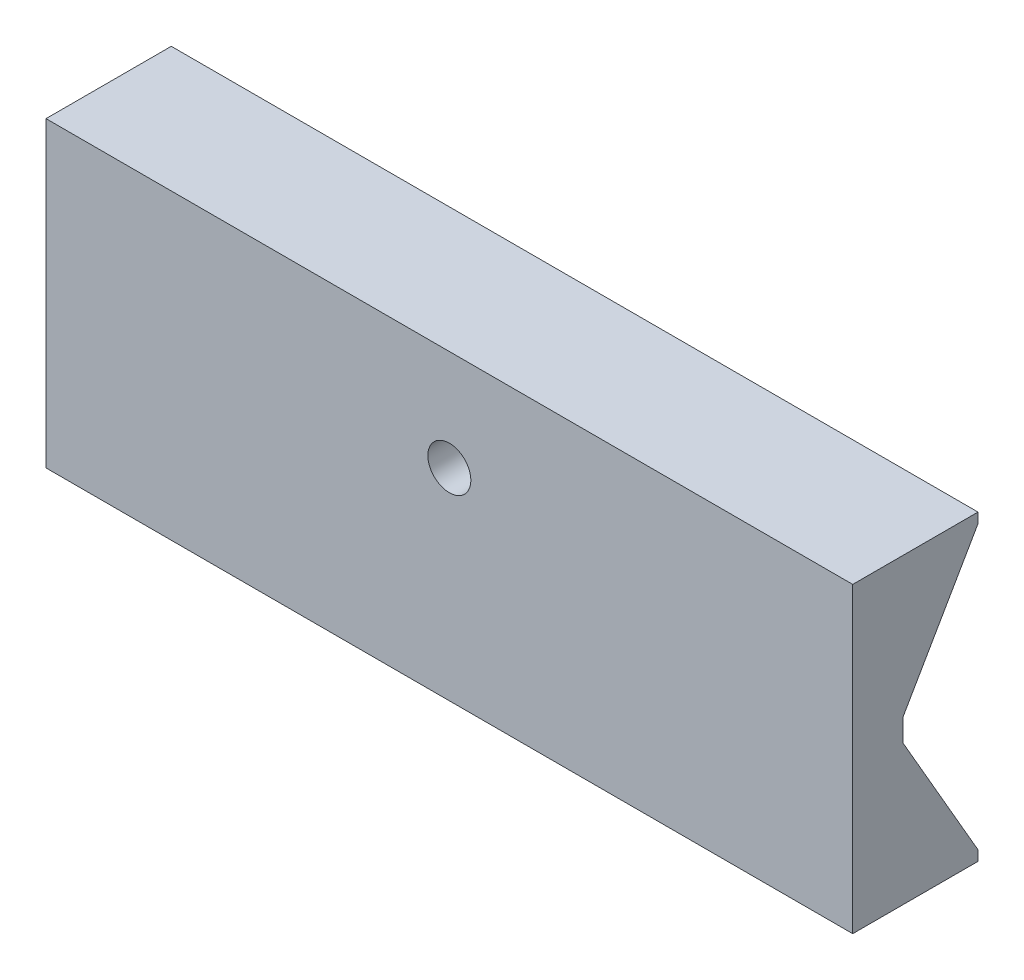
ISO-10303-21;
HEADER;
FILE_DESCRIPTION(('STEP AP214'),'2;1');
FILE_NAME('part.step','',(''),(''),'','','');
FILE_SCHEMA(('AUTOMOTIVE_DESIGN { 1 0 10303 214 1 1 1 1 }'));
ENDSEC;
DATA;
#1=APPLICATION_CONTEXT('core data for automotive mechanical design processes');
#2=APPLICATION_PROTOCOL_DEFINITION('international standard','automotive_design',2000,#1);
#3=PRODUCT_CONTEXT('',#1,'mechanical');
#4=PRODUCT('Part','Part','',(#3));
#5=PRODUCT_RELATED_PRODUCT_CATEGORY('part','',(#4));
#6=PRODUCT_DEFINITION_FORMATION('','',#4);
#7=PRODUCT_DEFINITION_CONTEXT('part definition',#1,'design');
#8=PRODUCT_DEFINITION('design','',#6,#7);
#9=PRODUCT_DEFINITION_SHAPE('','',#8);
#10=(LENGTH_UNIT() NAMED_UNIT(*) SI_UNIT(.MILLI.,.METRE.));
#11=(NAMED_UNIT(*) PLANE_ANGLE_UNIT() SI_UNIT($,.RADIAN.));
#12=(NAMED_UNIT(*) SI_UNIT($,.STERADIAN.) SOLID_ANGLE_UNIT());
#13=UNCERTAINTY_MEASURE_WITH_UNIT(LENGTH_MEASURE(1.E-05),#10,'distance_accuracy_value','');
#14=(GEOMETRIC_REPRESENTATION_CONTEXT(3) GLOBAL_UNCERTAINTY_ASSIGNED_CONTEXT((#13)) GLOBAL_UNIT_ASSIGNED_CONTEXT((#10,
#11,#12)) REPRESENTATION_CONTEXT('',''));
#15=CARTESIAN_POINT('',(0.,0.,0.));
#16=DIRECTION('',(0.,0.,1.));
#17=DIRECTION('',(1.,0.,0.));
#18=AXIS2_PLACEMENT_3D('',#15,#16,#17);
#19=CARTESIAN_POINT('',(101.6,-19.05,0.));
#20=DIRECTION('',(0.,1.,0.));
#21=DIRECTION('',(0.,0.,1.));
#22=AXIS2_PLACEMENT_3D('',#19,#20,#21);
#23=PLANE('',#22);
#24=DIRECTION('',(0.,0.,-1.));
#25=VECTOR('',#24,1.);
#26=CARTESIAN_POINT('',(0.,-19.05,0.));
#27=LINE('',#26,#25);
#28=CARTESIAN_POINT('',(0.,-19.05,0.));
#29=VERTEX_POINT('',#28);
#30=CARTESIAN_POINT('',(0.,-19.05,-15.7767651581292));
#31=VERTEX_POINT('',#30);
#32=EDGE_CURVE('E146',#29,#31,#27,.T.);
#33=ORIENTED_EDGE('',*,*,#32,.T.);
#34=DIRECTION('',(-1.,0.,0.));
#35=VECTOR('',#34,1.);
#36=CARTESIAN_POINT('',(101.6,-19.05,-15.7767651581292));
#37=LINE('',#36,#35);
#38=CARTESIAN_POINT('',(101.6,-19.05,-15.7767651581292));
#39=VERTEX_POINT('',#38);
#40=EDGE_CURVE('E13',#39,#31,#37,.T.);
#41=ORIENTED_EDGE('',*,*,#40,.F.);
#42=DIRECTION('',(0.,0.,-1.));
#43=VECTOR('',#42,1.);
#44=CARTESIAN_POINT('',(101.6,-19.05,0.));
#45=LINE('',#44,#43);
#46=CARTESIAN_POINT('',(101.6,-19.05,0.));
#47=VERTEX_POINT('',#46);
#48=EDGE_CURVE('E161',#47,#39,#45,.T.);
#49=ORIENTED_EDGE('',*,*,#48,.F.);
#50=DIRECTION('',(-1.,0.,0.));
#51=VECTOR('',#50,1.);
#52=CARTESIAN_POINT('',(101.6,-19.05,0.));
#53=LINE('',#52,#51);
#54=EDGE_CURVE('E142',#47,#29,#53,.T.);
#55=ORIENTED_EDGE('',*,*,#54,.T.);
#56=EDGE_LOOP('',(#33,#41,#49,#55));
#57=FACE_BOUND('',#56,.T.);
#58=ADVANCED_FACE('F50',(#57),#23,.F.);
#59=CARTESIAN_POINT('',(101.6,-17.78,-15.7767651581292));
#60=DIRECTION('',(0.,0.,1.));
#61=DIRECTION('',(1.,0.,0.));
#62=AXIS2_PLACEMENT_3D('',#59,#60,#61);
#63=PLANE('',#62);
#64=DIRECTION('',(0.,1.,0.));
#65=VECTOR('',#64,1.);
#66=CARTESIAN_POINT('',(0.,-17.78,-15.7767651581292));
#67=LINE('',#66,#65);
#68=CARTESIAN_POINT('',(0.,-17.78,-15.7767651581292));
#69=VERTEX_POINT('',#68);
#70=EDGE_CURVE('E149',#31,#69,#67,.T.);
#71=ORIENTED_EDGE('',*,*,#70,.T.);
#72=DIRECTION('',(-1.,0.,0.));
#73=VECTOR('',#72,1.);
#74=CARTESIAN_POINT('',(101.6,-17.78,-15.7767651581292));
#75=LINE('',#74,#73);
#76=CARTESIAN_POINT('',(101.6,-17.78,-15.7767651581292));
#77=VERTEX_POINT('',#76);
#78=EDGE_CURVE('E58',#77,#69,#75,.T.);
#79=ORIENTED_EDGE('',*,*,#78,.F.);
#80=DIRECTION('',(0.,1.,0.));
#81=VECTOR('',#80,1.);
#82=CARTESIAN_POINT('',(101.6,-17.78,-15.7767651581292));
#83=LINE('',#82,#81);
#84=EDGE_CURVE('E109',#39,#77,#83,.T.);
#85=ORIENTED_EDGE('',*,*,#84,.F.);
#86=ORIENTED_EDGE('',*,*,#40,.T.);
#87=EDGE_LOOP('',(#71,#79,#85,#86));
#88=FACE_BOUND('',#87,.T.);
#89=ADVANCED_FACE('F214',(#88),#63,.F.);
#90=CARTESIAN_POINT('',(101.6,-1.45236379510025,-6.35));
#91=DIRECTION('',(0.,-0.500000000000001,0.866025403784438));
#92=DIRECTION('',(0.,-0.866025403784438,-0.500000000000001));
#93=AXIS2_PLACEMENT_3D('',#90,#91,#92);
#94=PLANE('',#93);
#95=DIRECTION('',(0.,0.866025403784438,0.500000000000001));
#96=VECTOR('',#95,1.);
#97=CARTESIAN_POINT('',(0.,-1.45236379510025,-6.35));
#98=LINE('',#97,#96);
#99=CARTESIAN_POINT('',(0.,-1.45236379510025,-6.35));
#100=VERTEX_POINT('',#99);
#101=EDGE_CURVE('E152',#69,#100,#98,.T.);
#102=ORIENTED_EDGE('',*,*,#101,.T.);
#103=DIRECTION('',(-1.,0.,0.));
#104=VECTOR('',#103,1.);
#105=CARTESIAN_POINT('',(101.6,-1.45236379510025,-6.35));
#106=LINE('',#105,#104);
#107=CARTESIAN_POINT('',(101.6,-1.45236379510025,-6.35));
#108=VERTEX_POINT('',#107);
#109=EDGE_CURVE('E168',#108,#100,#106,.T.);
#110=ORIENTED_EDGE('',*,*,#109,.F.);
#111=DIRECTION('',(0.,0.866025403784438,0.500000000000001));
#112=VECTOR('',#111,1.);
#113=CARTESIAN_POINT('',(101.6,-1.45236379510025,-6.35));
#114=LINE('',#113,#112);
#115=EDGE_CURVE('E176',#77,#108,#114,.T.);
#116=ORIENTED_EDGE('',*,*,#115,.F.);
#117=ORIENTED_EDGE('',*,*,#78,.T.);
#118=EDGE_LOOP('',(#102,#110,#116,#117));
#119=FACE_BOUND('',#118,.T.);
#120=ADVANCED_FACE('F174',(#119),#94,.F.);
#121=CARTESIAN_POINT('',(101.6,1.45236379510025,-6.35));
#122=DIRECTION('',(0.,0.,1.));
#123=DIRECTION('',(1.,0.,0.));
#124=AXIS2_PLACEMENT_3D('',#121,#122,#123);
#125=PLANE('',#124);
#126=DIRECTION('',(0.,1.,0.));
#127=VECTOR('',#126,1.);
#128=CARTESIAN_POINT('',(0.,1.45236379510025,-6.35));
#129=LINE('',#128,#127);
#130=CARTESIAN_POINT('',(0.,1.45236379510025,-6.35));
#131=VERTEX_POINT('',#130);
#132=EDGE_CURVE('E154',#100,#131,#129,.T.);
#133=ORIENTED_EDGE('',*,*,#132,.T.);
#134=DIRECTION('',(-1.,0.,0.));
#135=VECTOR('',#134,1.);
#136=CARTESIAN_POINT('',(101.6,1.45236379510025,-6.35));
#137=LINE('',#136,#135);
#138=CARTESIAN_POINT('',(101.6,1.45236379510025,-6.35));
#139=VERTEX_POINT('',#138);
#140=EDGE_CURVE('E165',#139,#131,#137,.T.);
#141=ORIENTED_EDGE('',*,*,#140,.F.);
#142=DIRECTION('',(0.,1.,0.));
#143=VECTOR('',#142,1.);
#144=CARTESIAN_POINT('',(101.6,1.45236379510025,-6.35));
#145=LINE('',#144,#143);
#146=EDGE_CURVE('E188',#108,#139,#145,.T.);
#147=ORIENTED_EDGE('',*,*,#146,.F.);
#148=ORIENTED_EDGE('',*,*,#109,.T.);
#149=EDGE_LOOP('',(#133,#141,#147,#148));
#150=FACE_BOUND('',#149,.T.);
#151=ADVANCED_FACE('F184',(#150),#125,.F.);
#152=CARTESIAN_POINT('',(101.6,1.45236379510025,-6.35));
#153=DIRECTION('',(0.,0.500000000000001,0.866025403784438));
#154=DIRECTION('',(0.,-0.866025403784438,0.500000000000001));
#155=AXIS2_PLACEMENT_3D('',#152,#153,#154);
#156=PLANE('',#155);
#157=CARTESIAN_POINT('',(50.8,6.34999999999999,-9.17765158129173));
#158=DIRECTION('',(0.,0.500000000000001,0.866025403784438));
#159=DIRECTION('',(0.,-0.866025403784438,0.500000000000001));
#160=AXIS2_PLACEMENT_3D('',#157,#158,#159);
#161=ELLIPSE('',#160,3.12358042636971,2.7051);
#162=CARTESIAN_POINT('',(50.8,3.64489999999999,-7.61586136810687));
#163=VERTEX_POINT('',#162);
#164=EDGE_CURVE('E150',#163,#163,#161,.T.);
#165=ORIENTED_EDGE('',*,*,#164,.T.);
#166=EDGE_LOOP('',(#165));
#167=FACE_BOUND('',#166,.T.);
#168=DIRECTION('',(0.,0.866025403784438,-0.500000000000001));
#169=VECTOR('',#168,1.);
#170=CARTESIAN_POINT('',(0.,1.45236379510025,-6.35));
#171=LINE('',#170,#169);
#172=CARTESIAN_POINT('',(0.,17.78,-15.7767651581292));
#173=VERTEX_POINT('',#172);
#174=EDGE_CURVE('E156',#131,#173,#171,.T.);
#175=ORIENTED_EDGE('',*,*,#174,.T.);
#176=DIRECTION('',(-1.,0.,0.));
#177=VECTOR('',#176,1.);
#178=CARTESIAN_POINT('',(101.6,17.78,-15.7767651581292));
#179=LINE('',#178,#177);
#180=CARTESIAN_POINT('',(101.6,17.78,-15.7767651581292));
#181=VERTEX_POINT('',#180);
#182=EDGE_CURVE('E137',#181,#173,#179,.T.);
#183=ORIENTED_EDGE('',*,*,#182,.F.);
#184=DIRECTION('',(0.,0.866025403784438,-0.500000000000001));
#185=VECTOR('',#184,1.);
#186=CARTESIAN_POINT('',(101.6,1.45236379510025,-6.35));
#187=LINE('',#186,#185);
#188=EDGE_CURVE('E128',#139,#181,#187,.T.);
#189=ORIENTED_EDGE('',*,*,#188,.F.);
#190=ORIENTED_EDGE('',*,*,#140,.T.);
#191=EDGE_LOOP('',(#175,#183,#189,#190));
#192=FACE_BOUND('',#191,.T.);
#193=ADVANCED_FACE('F187',(#167,#192),#156,.F.);
#194=CARTESIAN_POINT('',(101.6,17.78,-15.7767651581292));
#195=DIRECTION('',(0.,0.,1.));
#196=DIRECTION('',(1.,0.,0.));
#197=AXIS2_PLACEMENT_3D('',#194,#195,#196);
#198=PLANE('',#197);
#199=DIRECTION('',(0.,1.,0.));
#200=VECTOR('',#199,1.);
#201=CARTESIAN_POINT('',(0.,17.78,-15.7767651581292));
#202=LINE('',#201,#200);
#203=CARTESIAN_POINT('',(0.,19.05,-15.7767651581292));
#204=VERTEX_POINT('',#203);
#205=EDGE_CURVE('E136',#173,#204,#202,.T.);
#206=ORIENTED_EDGE('',*,*,#205,.T.);
#207=DIRECTION('',(-1.,0.,0.));
#208=VECTOR('',#207,1.);
#209=CARTESIAN_POINT('',(101.6,19.05,-15.7767651581292));
#210=LINE('',#209,#208);
#211=CARTESIAN_POINT('',(101.6,19.05,-15.7767651581292));
#212=VERTEX_POINT('',#211);
#213=EDGE_CURVE('E133',#212,#204,#210,.T.);
#214=ORIENTED_EDGE('',*,*,#213,.F.);
#215=DIRECTION('',(0.,1.,0.));
#216=VECTOR('',#215,1.);
#217=CARTESIAN_POINT('',(101.6,17.78,-15.7767651581292));
#218=LINE('',#217,#216);
#219=EDGE_CURVE('E122',#181,#212,#218,.T.);
#220=ORIENTED_EDGE('',*,*,#219,.F.);
#221=ORIENTED_EDGE('',*,*,#182,.T.);
#222=EDGE_LOOP('',(#206,#214,#220,#221));
#223=FACE_BOUND('',#222,.T.);
#224=ADVANCED_FACE('F134',(#223),#198,.F.);
#225=CARTESIAN_POINT('',(101.6,19.05,-15.7767651581292));
#226=DIRECTION('',(0.,-1.,0.));
#227=DIRECTION('',(0.,0.,-1.));
#228=AXIS2_PLACEMENT_3D('',#225,#226,#227);
#229=PLANE('',#228);
#230=DIRECTION('',(0.,0.,1.));
#231=VECTOR('',#230,1.);
#232=CARTESIAN_POINT('',(0.,19.05,-15.7767651581292));
#233=LINE('',#232,#231);
#234=CARTESIAN_POINT('',(0.,19.05,0.));
#235=VERTEX_POINT('',#234);
#236=EDGE_CURVE('E95',#204,#235,#233,.T.);
#237=ORIENTED_EDGE('',*,*,#236,.T.);
#238=DIRECTION('',(-1.,0.,0.));
#239=VECTOR('',#238,1.);
#240=CARTESIAN_POINT('',(101.6,19.05,0.));
#241=LINE('',#240,#239);
#242=CARTESIAN_POINT('',(101.6,19.05,0.));
#243=VERTEX_POINT('',#242);
#244=EDGE_CURVE('E138',#243,#235,#241,.T.);
#245=ORIENTED_EDGE('',*,*,#244,.F.);
#246=DIRECTION('',(0.,0.,1.));
#247=VECTOR('',#246,1.);
#248=CARTESIAN_POINT('',(101.6,19.05,-15.7767651581292));
#249=LINE('',#248,#247);
#250=EDGE_CURVE('E126',#212,#243,#249,.T.);
#251=ORIENTED_EDGE('',*,*,#250,.F.);
#252=ORIENTED_EDGE('',*,*,#213,.T.);
#253=EDGE_LOOP('',(#237,#245,#251,#252));
#254=FACE_BOUND('',#253,.T.);
#255=ADVANCED_FACE('F140',(#254),#229,.F.);
#256=CARTESIAN_POINT('',(101.6,19.05,0.));
#257=DIRECTION('',(0.,0.,-1.));
#258=DIRECTION('',(-1.,0.,0.));
#259=AXIS2_PLACEMENT_3D('',#256,#257,#258);
#260=PLANE('',#259);
#261=CARTESIAN_POINT('',(50.8,6.34999999999999,0.));
#262=DIRECTION('',(0.,0.,1.));
#263=DIRECTION('',(1.,0.,0.));
#264=AXIS2_PLACEMENT_3D('',#261,#262,#263);
#265=CIRCLE('',#264,2.7051);
#266=CARTESIAN_POINT('',(53.5051,6.34999999999999,0.));
#267=VERTEX_POINT('',#266);
#268=EDGE_CURVE('E196',#267,#267,#265,.T.);
#269=ORIENTED_EDGE('',*,*,#268,.F.);
#270=EDGE_LOOP('',(#269));
#271=FACE_BOUND('',#270,.T.);
#272=DIRECTION('',(0.,-1.,0.));
#273=VECTOR('',#272,1.);
#274=CARTESIAN_POINT('',(0.,19.05,0.));
#275=LINE('',#274,#273);
#276=EDGE_CURVE('E101',#235,#29,#275,.T.);
#277=ORIENTED_EDGE('',*,*,#276,.T.);
#278=ORIENTED_EDGE('',*,*,#54,.F.);
#279=DIRECTION('',(0.,-1.,0.));
#280=VECTOR('',#279,1.);
#281=CARTESIAN_POINT('',(101.6,19.05,0.));
#282=LINE('',#281,#280);
#283=EDGE_CURVE('E66',#243,#47,#282,.T.);
#284=ORIENTED_EDGE('',*,*,#283,.F.);
#285=ORIENTED_EDGE('',*,*,#244,.T.);
#286=EDGE_LOOP('',(#277,#278,#284,#285));
#287=FACE_BOUND('',#286,.T.);
#288=ADVANCED_FACE('F203',(#271,#287),#260,.F.);
#289=CARTESIAN_POINT('',(101.6,0.,0.));
#290=DIRECTION('',(-1.,0.,0.));
#291=DIRECTION('',(0.,0.,1.));
#292=AXIS2_PLACEMENT_3D('',#289,#290,#291);
#293=PLANE('',#292);
#294=ORIENTED_EDGE('',*,*,#48,.T.);
#295=ORIENTED_EDGE('',*,*,#84,.T.);
#296=ORIENTED_EDGE('',*,*,#115,.T.);
#297=ORIENTED_EDGE('',*,*,#146,.T.);
#298=ORIENTED_EDGE('',*,*,#188,.T.);
#299=ORIENTED_EDGE('',*,*,#219,.T.);
#300=ORIENTED_EDGE('',*,*,#250,.T.);
#301=ORIENTED_EDGE('',*,*,#283,.T.);
#302=EDGE_LOOP('',(#294,#295,#296,#297,#298,#299,#300,#301));
#303=FACE_BOUND('',#302,.T.);
#304=ADVANCED_FACE('F124',(#303),#293,.F.);
#305=CARTESIAN_POINT('',(0.,0.,0.));
#306=DIRECTION('',(-1.,0.,0.));
#307=DIRECTION('',(0.,0.,1.));
#308=AXIS2_PLACEMENT_3D('',#305,#306,#307);
#309=PLANE('',#308);
#310=ORIENTED_EDGE('',*,*,#32,.F.);
#311=ORIENTED_EDGE('',*,*,#276,.F.);
#312=ORIENTED_EDGE('',*,*,#236,.F.);
#313=ORIENTED_EDGE('',*,*,#205,.F.);
#314=ORIENTED_EDGE('',*,*,#174,.F.);
#315=ORIENTED_EDGE('',*,*,#132,.F.);
#316=ORIENTED_EDGE('',*,*,#101,.F.);
#317=ORIENTED_EDGE('',*,*,#70,.F.);
#318=EDGE_LOOP('',(#310,#311,#312,#313,#314,#315,#316,#317));
#319=FACE_BOUND('',#318,.T.);
#320=ADVANCED_FACE('F180',(#319),#309,.T.);
#321=CARTESIAN_POINT('',(50.8,6.34999999999999,0.));
#322=DIRECTION('',(0.,0.,1.));
#323=DIRECTION('',(1.,0.,0.));
#324=AXIS2_PLACEMENT_3D('',#321,#322,#323);
#325=CYLINDRICAL_SURFACE('',#324,2.7051);
#326=ORIENTED_EDGE('',*,*,#268,.T.);
#327=EDGE_LOOP('',(#326));
#328=FACE_BOUND('',#327,.T.);
#329=ORIENTED_EDGE('',*,*,#164,.F.);
#330=EDGE_LOOP('',(#329));
#331=FACE_BOUND('',#330,.T.);
#332=ADVANCED_FACE('F200',(#328,#331),#325,.F.);
#333=CLOSED_SHELL('',(#58,#89,#120,#151,#193,#224,#255,#288,#304,#320,#332));
#334=MANIFOLD_SOLID_BREP('B2',#333);
#335=ADVANCED_BREP_SHAPE_REPRESENTATION('',(#18,#334),#14);
#336=SHAPE_DEFINITION_REPRESENTATION(#9,#335);
ENDSEC;
END-ISO-10303-21;
